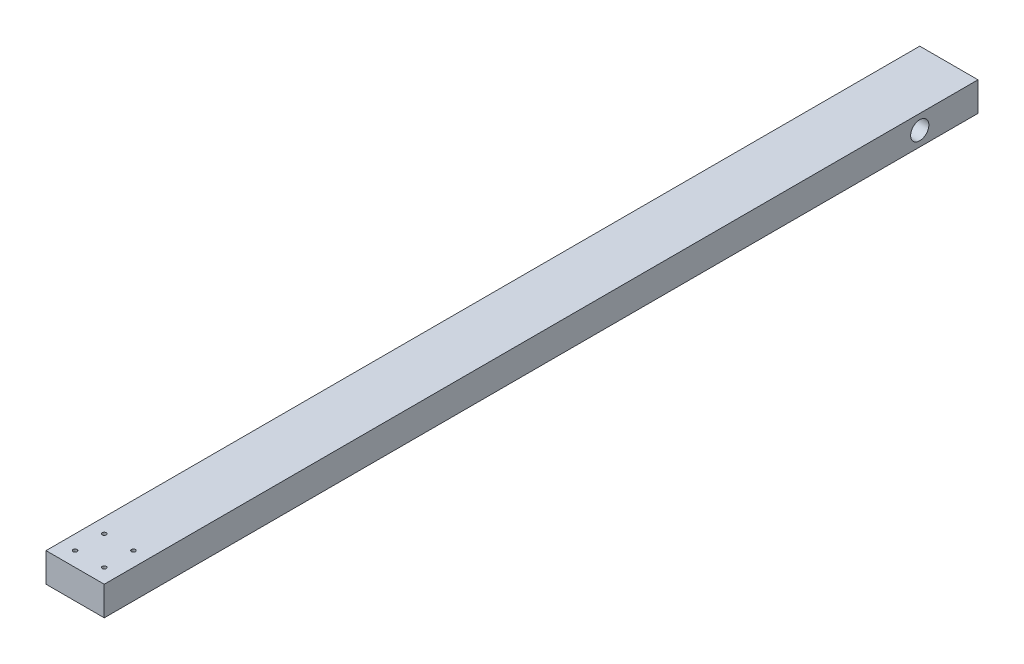
ISO-10303-21;
HEADER;
FILE_DESCRIPTION(('STEP AP214'),'2;1');
FILE_NAME('part.step','',(''),(''),'','','');
FILE_SCHEMA(('AUTOMOTIVE_DESIGN { 1 0 10303 214 1 1 1 1 }'));
ENDSEC;
DATA;
#1=APPLICATION_CONTEXT('core data for automotive mechanical design processes');
#2=APPLICATION_PROTOCOL_DEFINITION('international standard','automotive_design',2000,#1);
#3=PRODUCT_CONTEXT('',#1,'mechanical');
#4=PRODUCT('Part','Part','',(#3));
#5=PRODUCT_RELATED_PRODUCT_CATEGORY('part','',(#4));
#6=PRODUCT_DEFINITION_FORMATION('','',#4);
#7=PRODUCT_DEFINITION_CONTEXT('part definition',#1,'design');
#8=PRODUCT_DEFINITION('design','',#6,#7);
#9=PRODUCT_DEFINITION_SHAPE('','',#8);
#10=(LENGTH_UNIT() NAMED_UNIT(*) SI_UNIT(.MILLI.,.METRE.));
#11=(NAMED_UNIT(*) PLANE_ANGLE_UNIT() SI_UNIT($,.RADIAN.));
#12=(NAMED_UNIT(*) SI_UNIT($,.STERADIAN.) SOLID_ANGLE_UNIT());
#13=UNCERTAINTY_MEASURE_WITH_UNIT(LENGTH_MEASURE(1.E-05),#10,'distance_accuracy_value','');
#14=(GEOMETRIC_REPRESENTATION_CONTEXT(3) GLOBAL_UNCERTAINTY_ASSIGNED_CONTEXT((#13)) GLOBAL_UNIT_ASSIGNED_CONTEXT((#10,
#11,#12)) REPRESENTATION_CONTEXT('',''));
#15=CARTESIAN_POINT('',(0.,0.,0.));
#16=DIRECTION('',(0.,0.,1.));
#17=DIRECTION('',(1.,0.,0.));
#18=AXIS2_PLACEMENT_3D('',#15,#16,#17);
#19=CARTESIAN_POINT('',(50.8,25.4,1524.));
#20=DIRECTION('',(-1.,0.,0.));
#21=DIRECTION('',(0.,0.,1.));
#22=AXIS2_PLACEMENT_3D('',#19,#20,#21);
#23=PLANE('',#22);
#24=CARTESIAN_POINT('',(50.8,0.,101.6));
#25=DIRECTION('',(1.,0.,0.));
#26=DIRECTION('',(0.,0.,-1.));
#27=AXIS2_PLACEMENT_3D('',#24,#25,#26);
#28=CIRCLE('',#27,15.875);
#29=CARTESIAN_POINT('',(50.8,0.,85.725));
#30=VERTEX_POINT('',#29);
#31=EDGE_CURVE('E163',#30,#30,#28,.T.);
#32=ORIENTED_EDGE('',*,*,#31,.F.);
#33=EDGE_LOOP('',(#32));
#34=FACE_BOUND('',#33,.T.);
#35=DIRECTION('',(0.,1.,0.));
#36=VECTOR('',#35,1.);
#37=CARTESIAN_POINT('',(50.8,25.4,0.));
#38=LINE('',#37,#36);
#39=CARTESIAN_POINT('',(50.8,-25.4,0.));
#40=VERTEX_POINT('',#39);
#41=CARTESIAN_POINT('',(50.8,25.4,0.));
#42=VERTEX_POINT('',#41);
#43=EDGE_CURVE('E107',#40,#42,#38,.T.);
#44=ORIENTED_EDGE('',*,*,#43,.T.);
#45=DIRECTION('',(0.,0.,-1.));
#46=VECTOR('',#45,1.);
#47=CARTESIAN_POINT('',(50.8,25.4,1524.));
#48=LINE('',#47,#46);
#49=CARTESIAN_POINT('',(50.8,25.4,1524.));
#50=VERTEX_POINT('',#49);
#51=EDGE_CURVE('E11',#50,#42,#48,.T.);
#52=ORIENTED_EDGE('',*,*,#51,.F.);
#53=DIRECTION('',(0.,1.,0.));
#54=VECTOR('',#53,1.);
#55=CARTESIAN_POINT('',(50.8,25.4,1524.));
#56=LINE('',#55,#54);
#57=CARTESIAN_POINT('',(50.8,-25.4,1524.));
#58=VERTEX_POINT('',#57);
#59=EDGE_CURVE('E91',#58,#50,#56,.T.);
#60=ORIENTED_EDGE('',*,*,#59,.F.);
#61=DIRECTION('',(0.,0.,-1.));
#62=VECTOR('',#61,1.);
#63=CARTESIAN_POINT('',(50.8,-25.4,1524.));
#64=LINE('',#63,#62);
#65=EDGE_CURVE('E103',#58,#40,#64,.T.);
#66=ORIENTED_EDGE('',*,*,#65,.T.);
#67=EDGE_LOOP('',(#44,#52,#60,#66));
#68=FACE_BOUND('',#67,.T.);
#69=ADVANCED_FACE('F39',(#34,#68),#23,.F.);
#70=CARTESIAN_POINT('',(-50.8,25.4,1524.));
#71=DIRECTION('',(0.,-1.,0.));
#72=DIRECTION('',(0.,0.,-1.));
#73=AXIS2_PLACEMENT_3D('',#70,#71,#72);
#74=PLANE('',#73);
#75=CARTESIAN_POINT('',(-25.3999999999999,25.4,1447.8));
#76=DIRECTION('',(0.,1.,0.));
#77=DIRECTION('',(0.,0.,1.));
#78=AXIS2_PLACEMENT_3D('',#75,#76,#77);
#79=CIRCLE('',#78,3.49249999999999);
#80=CARTESIAN_POINT('',(-25.3999999999999,25.4,1451.2925));
#81=VERTEX_POINT('',#80);
#82=EDGE_CURVE('E140',#81,#81,#79,.T.);
#83=ORIENTED_EDGE('',*,*,#82,.F.);
#84=EDGE_LOOP('',(#83));
#85=FACE_BOUND('',#84,.T.);
#86=CARTESIAN_POINT('',(25.4000000000001,25.4,1498.6));
#87=DIRECTION('',(0.,1.,0.));
#88=DIRECTION('',(0.,0.,1.));
#89=AXIS2_PLACEMENT_3D('',#86,#87,#88);
#90=CIRCLE('',#89,3.49249999999999);
#91=CARTESIAN_POINT('',(25.4000000000001,25.4,1502.0925));
#92=VERTEX_POINT('',#91);
#93=EDGE_CURVE('E141',#92,#92,#90,.T.);
#94=ORIENTED_EDGE('',*,*,#93,.F.);
#95=EDGE_LOOP('',(#94));
#96=FACE_BOUND('',#95,.T.);
#97=CARTESIAN_POINT('',(-25.3999999999999,25.4,1498.6));
#98=DIRECTION('',(0.,1.,0.));
#99=DIRECTION('',(0.,0.,1.));
#100=AXIS2_PLACEMENT_3D('',#97,#98,#99);
#101=CIRCLE('',#100,3.49249999999999);
#102=CARTESIAN_POINT('',(-25.3999999999999,25.4,1502.0925));
#103=VERTEX_POINT('',#102);
#104=EDGE_CURVE('E155',#103,#103,#101,.T.);
#105=ORIENTED_EDGE('',*,*,#104,.F.);
#106=EDGE_LOOP('',(#105));
#107=FACE_BOUND('',#106,.T.);
#108=CARTESIAN_POINT('',(25.4000000000001,25.4,1447.8));
#109=DIRECTION('',(0.,1.,0.));
#110=DIRECTION('',(0.,0.,1.));
#111=AXIS2_PLACEMENT_3D('',#108,#109,#110);
#112=CIRCLE('',#111,3.49249999999999);
#113=CARTESIAN_POINT('',(25.4000000000001,25.4,1451.2925));
#114=VERTEX_POINT('',#113);
#115=EDGE_CURVE('E131',#114,#114,#112,.T.);
#116=ORIENTED_EDGE('',*,*,#115,.F.);
#117=EDGE_LOOP('',(#116));
#118=FACE_BOUND('',#117,.T.);
#119=DIRECTION('',(-1.,0.,0.));
#120=VECTOR('',#119,1.);
#121=CARTESIAN_POINT('',(-50.8,25.4,0.));
#122=LINE('',#121,#120);
#123=CARTESIAN_POINT('',(-50.8,25.4,0.));
#124=VERTEX_POINT('',#123);
#125=EDGE_CURVE('E96',#42,#124,#122,.T.);
#126=ORIENTED_EDGE('',*,*,#125,.T.);
#127=DIRECTION('',(0.,0.,-1.));
#128=VECTOR('',#127,1.);
#129=CARTESIAN_POINT('',(-50.8,25.4,1524.));
#130=LINE('',#129,#128);
#131=CARTESIAN_POINT('',(-50.8,25.4,1524.));
#132=VERTEX_POINT('',#131);
#133=EDGE_CURVE('E48',#132,#124,#130,.T.);
#134=ORIENTED_EDGE('',*,*,#133,.F.);
#135=DIRECTION('',(-1.,0.,0.));
#136=VECTOR('',#135,1.);
#137=CARTESIAN_POINT('',(-50.8,25.4,1524.));
#138=LINE('',#137,#136);
#139=EDGE_CURVE('E86',#50,#132,#138,.T.);
#140=ORIENTED_EDGE('',*,*,#139,.F.);
#141=ORIENTED_EDGE('',*,*,#51,.T.);
#142=EDGE_LOOP('',(#126,#134,#140,#141));
#143=FACE_BOUND('',#142,.T.);
#144=ADVANCED_FACE('F95',(#85,#96,#107,#118,#143),#74,.F.);
#145=CARTESIAN_POINT('',(-50.8,25.4,1524.));
#146=DIRECTION('',(1.,0.,0.));
#147=DIRECTION('',(0.,0.,-1.));
#148=AXIS2_PLACEMENT_3D('',#145,#146,#147);
#149=PLANE('',#148);
#150=CARTESIAN_POINT('',(-50.8,0.,101.6));
#151=DIRECTION('',(1.,0.,0.));
#152=DIRECTION('',(0.,0.,-1.));
#153=AXIS2_PLACEMENT_3D('',#150,#151,#152);
#154=CIRCLE('',#153,15.875);
#155=CARTESIAN_POINT('',(-50.8,0.,85.725));
#156=VERTEX_POINT('',#155);
#157=EDGE_CURVE('E159',#156,#156,#154,.F.);
#158=ORIENTED_EDGE('',*,*,#157,.F.);
#159=EDGE_LOOP('',(#158));
#160=FACE_BOUND('',#159,.T.);
#161=DIRECTION('',(0.,-1.,0.));
#162=VECTOR('',#161,1.);
#163=CARTESIAN_POINT('',(-50.8,25.4,0.));
#164=LINE('',#163,#162);
#165=CARTESIAN_POINT('',(-50.8,-25.4,0.));
#166=VERTEX_POINT('',#165);
#167=EDGE_CURVE('E73',#124,#166,#164,.T.);
#168=ORIENTED_EDGE('',*,*,#167,.T.);
#169=DIRECTION('',(0.,0.,-1.));
#170=VECTOR('',#169,1.);
#171=CARTESIAN_POINT('',(-50.8,-25.4,1524.));
#172=LINE('',#171,#170);
#173=CARTESIAN_POINT('',(-50.8,-25.4,1524.));
#174=VERTEX_POINT('',#173);
#175=EDGE_CURVE('E98',#174,#166,#172,.T.);
#176=ORIENTED_EDGE('',*,*,#175,.F.);
#177=DIRECTION('',(0.,-1.,0.));
#178=VECTOR('',#177,1.);
#179=CARTESIAN_POINT('',(-50.8,25.4,1524.));
#180=LINE('',#179,#178);
#181=EDGE_CURVE('E89',#132,#174,#180,.T.);
#182=ORIENTED_EDGE('',*,*,#181,.F.);
#183=ORIENTED_EDGE('',*,*,#133,.T.);
#184=EDGE_LOOP('',(#168,#176,#182,#183));
#185=FACE_BOUND('',#184,.T.);
#186=ADVANCED_FACE('F99',(#160,#185),#149,.F.);
#187=CARTESIAN_POINT('',(-50.8,-25.4,1524.));
#188=DIRECTION('',(0.,1.,0.));
#189=DIRECTION('',(0.,0.,1.));
#190=AXIS2_PLACEMENT_3D('',#187,#188,#189);
#191=PLANE('',#190);
#192=CARTESIAN_POINT('',(-25.3999999999999,-25.4,1447.8));
#193=DIRECTION('',(0.,1.,0.));
#194=DIRECTION('',(0.,0.,1.));
#195=AXIS2_PLACEMENT_3D('',#192,#193,#194);
#196=CIRCLE('',#195,3.49249999999999);
#197=CARTESIAN_POINT('',(-25.3999999999999,-25.4,1451.2925));
#198=VERTEX_POINT('',#197);
#199=EDGE_CURVE('E135',#198,#198,#196,.F.);
#200=ORIENTED_EDGE('',*,*,#199,.F.);
#201=EDGE_LOOP('',(#200));
#202=FACE_BOUND('',#201,.T.);
#203=CARTESIAN_POINT('',(25.4000000000001,-25.4,1498.6));
#204=DIRECTION('',(0.,1.,0.));
#205=DIRECTION('',(0.,0.,1.));
#206=AXIS2_PLACEMENT_3D('',#203,#204,#205);
#207=CIRCLE('',#206,3.49249999999999);
#208=CARTESIAN_POINT('',(25.4000000000001,-25.4,1502.0925));
#209=VERTEX_POINT('',#208);
#210=EDGE_CURVE('E136',#209,#209,#207,.F.);
#211=ORIENTED_EDGE('',*,*,#210,.F.);
#212=EDGE_LOOP('',(#211));
#213=FACE_BOUND('',#212,.T.);
#214=CARTESIAN_POINT('',(-25.3999999999999,-25.4,1498.6));
#215=DIRECTION('',(0.,1.,0.));
#216=DIRECTION('',(0.,0.,1.));
#217=AXIS2_PLACEMENT_3D('',#214,#215,#216);
#218=CIRCLE('',#217,3.49249999999999);
#219=CARTESIAN_POINT('',(-25.3999999999999,-25.4,1502.0925));
#220=VERTEX_POINT('',#219);
#221=EDGE_CURVE('E145',#220,#220,#218,.F.);
#222=ORIENTED_EDGE('',*,*,#221,.F.);
#223=EDGE_LOOP('',(#222));
#224=FACE_BOUND('',#223,.T.);
#225=CARTESIAN_POINT('',(25.4000000000001,-25.4,1447.8));
#226=DIRECTION('',(0.,1.,0.));
#227=DIRECTION('',(0.,0.,1.));
#228=AXIS2_PLACEMENT_3D('',#225,#226,#227);
#229=CIRCLE('',#228,3.49249999999999);
#230=CARTESIAN_POINT('',(25.4000000000001,-25.4,1451.2925));
#231=VERTEX_POINT('',#230);
#232=EDGE_CURVE('E111',#231,#231,#229,.F.);
#233=ORIENTED_EDGE('',*,*,#232,.F.);
#234=EDGE_LOOP('',(#233));
#235=FACE_BOUND('',#234,.T.);
#236=DIRECTION('',(1.,0.,0.));
#237=VECTOR('',#236,1.);
#238=CARTESIAN_POINT('',(-50.8,-25.4,0.));
#239=LINE('',#238,#237);
#240=EDGE_CURVE('E79',#166,#40,#239,.T.);
#241=ORIENTED_EDGE('',*,*,#240,.T.);
#242=ORIENTED_EDGE('',*,*,#65,.F.);
#243=DIRECTION('',(1.,0.,0.));
#244=VECTOR('',#243,1.);
#245=CARTESIAN_POINT('',(-50.8,-25.4,1524.));
#246=LINE('',#245,#244);
#247=EDGE_CURVE('E56',#174,#58,#246,.T.);
#248=ORIENTED_EDGE('',*,*,#247,.F.);
#249=ORIENTED_EDGE('',*,*,#175,.T.);
#250=EDGE_LOOP('',(#241,#242,#248,#249));
#251=FACE_BOUND('',#250,.T.);
#252=ADVANCED_FACE('F121',(#202,#213,#224,#235,#251),#191,.F.);
#253=CARTESIAN_POINT('',(0.,0.,1524.));
#254=DIRECTION('',(0.,0.,1.));
#255=DIRECTION('',(1.,0.,0.));
#256=AXIS2_PLACEMENT_3D('',#253,#254,#255);
#257=PLANE('',#256);
#258=ORIENTED_EDGE('',*,*,#59,.T.);
#259=ORIENTED_EDGE('',*,*,#139,.T.);
#260=ORIENTED_EDGE('',*,*,#181,.T.);
#261=ORIENTED_EDGE('',*,*,#247,.T.);
#262=EDGE_LOOP('',(#258,#259,#260,#261));
#263=FACE_BOUND('',#262,.T.);
#264=ADVANCED_FACE('F87',(#263),#257,.T.);
#265=CARTESIAN_POINT('',(0.,0.,0.));
#266=DIRECTION('',(0.,0.,1.));
#267=DIRECTION('',(1.,0.,0.));
#268=AXIS2_PLACEMENT_3D('',#265,#266,#267);
#269=PLANE('',#268);
#270=ORIENTED_EDGE('',*,*,#43,.F.);
#271=ORIENTED_EDGE('',*,*,#240,.F.);
#272=ORIENTED_EDGE('',*,*,#167,.F.);
#273=ORIENTED_EDGE('',*,*,#125,.F.);
#274=EDGE_LOOP('',(#270,#271,#272,#273));
#275=FACE_BOUND('',#274,.T.);
#276=ADVANCED_FACE('F124',(#275),#269,.F.);
#277=CARTESIAN_POINT('',(25.4000000000001,-35.2782817331759,1447.8));
#278=DIRECTION('',(0.,1.,0.));
#279=DIRECTION('',(0.,0.,1.));
#280=AXIS2_PLACEMENT_3D('',#277,#278,#279);
#281=CYLINDRICAL_SURFACE('',#280,3.49249999999999);
#282=ORIENTED_EDGE('',*,*,#232,.T.);
#283=EDGE_LOOP('',(#282));
#284=FACE_BOUND('',#283,.T.);
#285=ORIENTED_EDGE('',*,*,#115,.T.);
#286=EDGE_LOOP('',(#285));
#287=FACE_BOUND('',#286,.T.);
#288=ADVANCED_FACE('F188',(#284,#287),#281,.F.);
#289=CARTESIAN_POINT('',(-25.3999999999999,-35.2782817331759,1498.6));
#290=DIRECTION('',(0.,1.,0.));
#291=DIRECTION('',(0.,0.,1.));
#292=AXIS2_PLACEMENT_3D('',#289,#290,#291);
#293=CYLINDRICAL_SURFACE('',#292,3.49249999999999);
#294=ORIENTED_EDGE('',*,*,#221,.T.);
#295=EDGE_LOOP('',(#294));
#296=FACE_BOUND('',#295,.T.);
#297=ORIENTED_EDGE('',*,*,#104,.T.);
#298=EDGE_LOOP('',(#297));
#299=FACE_BOUND('',#298,.T.);
#300=ADVANCED_FACE('F193',(#296,#299),#293,.F.);
#301=CARTESIAN_POINT('',(25.4000000000001,-35.2782817331759,1498.6));
#302=DIRECTION('',(0.,1.,0.));
#303=DIRECTION('',(0.,0.,1.));
#304=AXIS2_PLACEMENT_3D('',#301,#302,#303);
#305=CYLINDRICAL_SURFACE('',#304,3.49249999999999);
#306=ORIENTED_EDGE('',*,*,#210,.T.);
#307=EDGE_LOOP('',(#306));
#308=FACE_BOUND('',#307,.T.);
#309=ORIENTED_EDGE('',*,*,#93,.T.);
#310=EDGE_LOOP('',(#309));
#311=FACE_BOUND('',#310,.T.);
#312=ADVANCED_FACE('F195',(#308,#311),#305,.F.);
#313=CARTESIAN_POINT('',(-25.3999999999999,-35.2782817331759,1447.8));
#314=DIRECTION('',(0.,1.,0.));
#315=DIRECTION('',(0.,0.,1.));
#316=AXIS2_PLACEMENT_3D('',#313,#314,#315);
#317=CYLINDRICAL_SURFACE('',#316,3.49249999999999);
#318=ORIENTED_EDGE('',*,*,#199,.T.);
#319=EDGE_LOOP('',(#318));
#320=FACE_BOUND('',#319,.T.);
#321=ORIENTED_EDGE('',*,*,#82,.T.);
#322=EDGE_LOOP('',(#321));
#323=FACE_BOUND('',#322,.T.);
#324=ADVANCED_FACE('F198',(#320,#323),#317,.F.);
#325=CARTESIAN_POINT('',(-95.7012806053458,0.,101.6));
#326=DIRECTION('',(1.,0.,0.));
#327=DIRECTION('',(0.,0.,-1.));
#328=AXIS2_PLACEMENT_3D('',#325,#326,#327);
#329=CYLINDRICAL_SURFACE('',#328,15.875);
#330=CARTESIAN_POINT('',(-50.8,0.,85.725));
#331=CARTESIAN_POINT('',(-49.7416666666667,0.,85.725));
#332=CARTESIAN_POINT('',(-48.6833333333333,0.,85.725));
#333=CARTESIAN_POINT('',(-46.5666666666667,0.,85.725));
#334=CARTESIAN_POINT('',(-45.5083333333333,0.,85.725));
#335=CARTESIAN_POINT('',(-43.3916666666667,0.,85.725));
#336=CARTESIAN_POINT('',(-42.3333333333333,0.,85.725));
#337=CARTESIAN_POINT('',(-40.2166666666667,0.,85.725));
#338=CARTESIAN_POINT('',(-39.1583333333333,0.,85.725));
#339=CARTESIAN_POINT('',(-37.0416666666667,0.,85.725));
#340=CARTESIAN_POINT('',(-35.9833333333333,0.,85.725));
#341=CARTESIAN_POINT('',(-33.8666666666667,0.,85.725));
#342=CARTESIAN_POINT('',(-32.8083333333333,0.,85.725));
#343=CARTESIAN_POINT('',(-30.6916666666667,0.,85.725));
#344=CARTESIAN_POINT('',(-29.6333333333333,0.,85.725));
#345=CARTESIAN_POINT('',(-27.5166666666667,0.,85.725));
#346=CARTESIAN_POINT('',(-26.4583333333333,0.,85.725));
#347=CARTESIAN_POINT('',(-24.3416666666667,0.,85.725));
#348=CARTESIAN_POINT('',(-23.2833333333333,0.,85.725));
#349=CARTESIAN_POINT('',(-21.1666666666667,0.,85.725));
#350=CARTESIAN_POINT('',(-20.1083333333333,0.,85.725));
#351=CARTESIAN_POINT('',(-17.9916666666667,0.,85.725));
#352=CARTESIAN_POINT('',(-16.9333333333333,0.,85.725));
#353=CARTESIAN_POINT('',(-14.8166666666667,0.,85.725));
#354=CARTESIAN_POINT('',(-13.7583333333333,0.,85.725));
#355=CARTESIAN_POINT('',(-11.6416666666667,0.,85.725));
#356=CARTESIAN_POINT('',(-10.5833333333333,0.,85.725));
#357=CARTESIAN_POINT('',(-8.46666666666667,0.,85.725));
#358=CARTESIAN_POINT('',(-7.40833333333333,0.,85.725));
#359=CARTESIAN_POINT('',(-5.29166666666666,0.,85.725));
#360=CARTESIAN_POINT('',(-4.23333333333333,0.,85.725));
#361=CARTESIAN_POINT('',(-2.11666666666666,0.,85.725));
#362=CARTESIAN_POINT('',(-1.05833333333333,0.,85.725));
#363=CARTESIAN_POINT('',(1.05833333333333,0.,85.725));
#364=CARTESIAN_POINT('',(2.11666666666666,0.,85.725));
#365=CARTESIAN_POINT('',(4.23333333333333,0.,85.725));
#366=CARTESIAN_POINT('',(5.29166666666666,0.,85.725));
#367=CARTESIAN_POINT('',(7.40833333333333,0.,85.725));
#368=CARTESIAN_POINT('',(8.46666666666667,0.,85.725));
#369=CARTESIAN_POINT('',(10.5833333333333,0.,85.725));
#370=CARTESIAN_POINT('',(11.6416666666667,0.,85.725));
#371=CARTESIAN_POINT('',(13.7583333333333,0.,85.725));
#372=CARTESIAN_POINT('',(14.8166666666667,0.,85.725));
#373=CARTESIAN_POINT('',(16.9333333333333,0.,85.725));
#374=CARTESIAN_POINT('',(17.9916666666667,0.,85.725));
#375=CARTESIAN_POINT('',(20.1083333333333,0.,85.725));
#376=CARTESIAN_POINT('',(21.1666666666667,0.,85.725));
#377=CARTESIAN_POINT('',(23.2833333333333,0.,85.725));
#378=CARTESIAN_POINT('',(24.3416666666667,0.,85.725));
#379=CARTESIAN_POINT('',(26.4583333333333,0.,85.725));
#380=CARTESIAN_POINT('',(27.5166666666667,0.,85.725));
#381=CARTESIAN_POINT('',(29.6333333333333,0.,85.725));
#382=CARTESIAN_POINT('',(30.6916666666667,0.,85.725));
#383=CARTESIAN_POINT('',(32.8083333333333,0.,85.725));
#384=CARTESIAN_POINT('',(33.8666666666667,0.,85.725));
#385=CARTESIAN_POINT('',(35.9833333333333,0.,85.725));
#386=CARTESIAN_POINT('',(37.0416666666667,0.,85.725));
#387=CARTESIAN_POINT('',(39.1583333333333,0.,85.725));
#388=CARTESIAN_POINT('',(40.2166666666667,0.,85.725));
#389=CARTESIAN_POINT('',(42.3333333333333,0.,85.725));
#390=CARTESIAN_POINT('',(43.3916666666667,0.,85.725));
#391=CARTESIAN_POINT('',(45.5083333333333,0.,85.725));
#392=CARTESIAN_POINT('',(46.5666666666667,0.,85.725));
#393=CARTESIAN_POINT('',(48.6833333333333,0.,85.725));
#394=CARTESIAN_POINT('',(49.7416666666667,0.,85.725));
#395=CARTESIAN_POINT('',(50.8,0.,85.725));
#396=B_SPLINE_CURVE_WITH_KNOTS('',3,(#330,#331,#332,#333,#334,#335,#336,#337,#338,#339,#340,
#341,#342,#343,#344,#345,#346,#347,#348,#349,#350,#351,#352,#353,#354,#355,#356,#357,#358,#359,
#360,#361,#362,#363,#364,#365,#366,#367,#368,#369,#370,#371,#372,#373,#374,#375,#376,#377,#378,
#379,#380,#381,#382,#383,#384,#385,#386,#387,#388,#389,#390,#391,#392,#393,#394,#395),
.UNSPECIFIED.,.F.,.F.,(4,2,2,2,2,2,2,2,2,2,2,2,2,2,2,2,2,2,2,2,2,2,2,2,2,2,2,2,2,2,2,2,4),(0.,
3.175,6.35,9.52500000000001,12.7,15.875,19.05,22.225,25.4,28.575,31.75,34.925,38.1,41.275,44.45,
47.625,50.8,53.975,57.15,60.325,63.5,66.675,69.85,73.025,76.2,79.375,82.55,85.725,88.9,92.075,
95.25,98.425,101.6),.UNSPECIFIED.);
#397=EDGE_CURVE('BSEAM168',#156,#30,#396,.T.);
#398=ORIENTED_EDGE('',*,*,#157,.T.);
#399=ORIENTED_EDGE('',*,*,#31,.T.);
#400=ORIENTED_EDGE('',*,*,#397,.T.);
#401=ORIENTED_EDGE('',*,*,#397,.F.);
#402=EDGE_LOOP('',(#398,#400,#399,#401));
#403=FACE_BOUND('',#402,.T.);
#404=ADVANCED_FACE('F168',(#403),#329,.F.);
#405=CLOSED_SHELL('',(#69,#144,#186,#252,#264,#276,#288,#300,#312,#324,#404));
#406=MANIFOLD_SOLID_BREP('B2',#405);
#407=ADVANCED_BREP_SHAPE_REPRESENTATION('',(#18,#406),#14);
#408=SHAPE_DEFINITION_REPRESENTATION(#9,#407);
ENDSEC;
END-ISO-10303-21;
